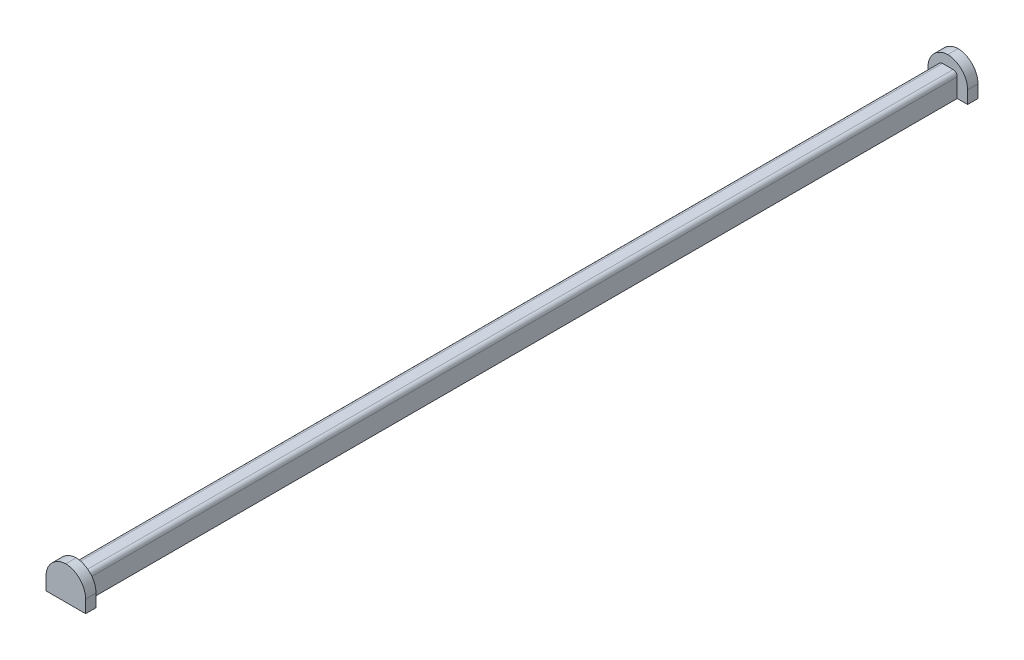
ISO-10303-21;
HEADER;
FILE_DESCRIPTION(('STEP AP214'),'2;1');
FILE_NAME('part.step','',(''),(''),'','','');
FILE_SCHEMA(('AUTOMOTIVE_DESIGN { 1 0 10303 214 1 1 1 1 }'));
ENDSEC;
DATA;
#1=APPLICATION_CONTEXT('core data for automotive mechanical design processes');
#2=APPLICATION_PROTOCOL_DEFINITION('international standard','automotive_design',2000,#1);
#3=PRODUCT_CONTEXT('',#1,'mechanical');
#4=PRODUCT('Part','Part','',(#3));
#5=PRODUCT_RELATED_PRODUCT_CATEGORY('part','',(#4));
#6=PRODUCT_DEFINITION_FORMATION('','',#4);
#7=PRODUCT_DEFINITION_CONTEXT('part definition',#1,'design');
#8=PRODUCT_DEFINITION('design','',#6,#7);
#9=PRODUCT_DEFINITION_SHAPE('','',#8);
#10=(LENGTH_UNIT() NAMED_UNIT(*) SI_UNIT(.MILLI.,.METRE.));
#11=(NAMED_UNIT(*) PLANE_ANGLE_UNIT() SI_UNIT($,.RADIAN.));
#12=(NAMED_UNIT(*) SI_UNIT($,.STERADIAN.) SOLID_ANGLE_UNIT());
#13=UNCERTAINTY_MEASURE_WITH_UNIT(LENGTH_MEASURE(1.E-05),#10,'distance_accuracy_value','');
#14=(GEOMETRIC_REPRESENTATION_CONTEXT(3) GLOBAL_UNCERTAINTY_ASSIGNED_CONTEXT((#13)) GLOBAL_UNIT_ASSIGNED_CONTEXT((#10,
#11,#12)) REPRESENTATION_CONTEXT('',''));
#15=CARTESIAN_POINT('',(0.,0.,0.));
#16=DIRECTION('',(0.,0.,1.));
#17=DIRECTION('',(1.,0.,0.));
#18=AXIS2_PLACEMENT_3D('',#15,#16,#17);
#19=CARTESIAN_POINT('',(3.032125,0.142875,133.35));
#20=DIRECTION('',(0.,-1.,0.));
#21=DIRECTION('',(1.,0.,0.));
#22=AXIS2_PLACEMENT_3D('',#19,#20,#21);
#23=PLANE('',#22);
#24=DIRECTION('',(0.,0.,-1.));
#25=VECTOR('',#24,1.);
#26=CARTESIAN_POINT('',(0.142875,0.142875,133.35));
#27=LINE('',#26,#25);
#28=CARTESIAN_POINT('',(0.142875,0.142875,133.35));
#29=VERTEX_POINT('',#28);
#30=CARTESIAN_POINT('',(0.142875,0.142875,0.));
#31=VERTEX_POINT('',#30);
#32=EDGE_CURVE('E219',#29,#31,#27,.T.);
#33=ORIENTED_EDGE('',*,*,#32,.T.);
#34=DIRECTION('',(1.,0.,0.));
#35=VECTOR('',#34,1.);
#36=CARTESIAN_POINT('',(-1.444625,0.142875,0.));
#37=LINE('',#36,#35);
#38=CARTESIAN_POINT('',(-1.444625,0.142875,0.));
#39=VERTEX_POINT('',#38);
#40=EDGE_CURVE('E156',#39,#31,#37,.T.);
#41=ORIENTED_EDGE('',*,*,#40,.F.);
#42=DIRECTION('',(0.,0.,1.));
#43=VECTOR('',#42,1.);
#44=CARTESIAN_POINT('',(-1.444625,0.142875,-1.5875));
#45=LINE('',#44,#43);
#46=CARTESIAN_POINT('',(-1.444625,0.142875,-1.5875));
#47=VERTEX_POINT('',#46);
#48=EDGE_CURVE('E148',#47,#39,#45,.T.);
#49=ORIENTED_EDGE('',*,*,#48,.F.);
#50=DIRECTION('',(1.,0.,0.));
#51=VECTOR('',#50,1.);
#52=CARTESIAN_POINT('',(-1.444625,0.142875,-1.5875));
#53=LINE('',#52,#51);
#54=CARTESIAN_POINT('',(4.619625,0.142875,-1.5875));
#55=VERTEX_POINT('',#54);
#56=EDGE_CURVE('E153',#47,#55,#53,.T.);
#57=ORIENTED_EDGE('',*,*,#56,.T.);
#58=DIRECTION('',(0.,0.,1.));
#59=VECTOR('',#58,1.);
#60=CARTESIAN_POINT('',(4.619625,0.142875,-1.5875));
#61=LINE('',#60,#59);
#62=CARTESIAN_POINT('',(4.619625,0.142875,0.));
#63=VERTEX_POINT('',#62);
#64=EDGE_CURVE('E160',#55,#63,#61,.T.);
#65=ORIENTED_EDGE('',*,*,#64,.T.);
#66=CARTESIAN_POINT('',(3.032125,0.142875,0.));
#67=VERTEX_POINT('',#66);
#68=EDGE_CURVE('E179',#67,#63,#37,.T.);
#69=ORIENTED_EDGE('',*,*,#68,.F.);
#70=DIRECTION('',(0.,0.,-1.));
#71=VECTOR('',#70,1.);
#72=CARTESIAN_POINT('',(3.032125,0.142875,133.35));
#73=LINE('',#72,#71);
#74=CARTESIAN_POINT('',(3.032125,0.142875,133.35));
#75=VERTEX_POINT('',#74);
#76=EDGE_CURVE('E224',#75,#67,#73,.T.);
#77=ORIENTED_EDGE('',*,*,#76,.F.);
#78=DIRECTION('',(1.,0.,0.));
#79=VECTOR('',#78,1.);
#80=CARTESIAN_POINT('',(-1.444625,0.142875,133.35));
#81=LINE('',#80,#79);
#82=CARTESIAN_POINT('',(4.619625,0.142875,133.35));
#83=VERTEX_POINT('',#82);
#84=EDGE_CURVE('E199',#75,#83,#81,.T.);
#85=ORIENTED_EDGE('',*,*,#84,.T.);
#86=DIRECTION('',(0.,0.,-1.));
#87=VECTOR('',#86,1.);
#88=CARTESIAN_POINT('',(4.619625,0.142875,134.9375));
#89=LINE('',#88,#87);
#90=CARTESIAN_POINT('',(4.619625,0.142875,134.9375));
#91=VERTEX_POINT('',#90);
#92=EDGE_CURVE('E195',#91,#83,#89,.T.);
#93=ORIENTED_EDGE('',*,*,#92,.F.);
#94=DIRECTION('',(1.,0.,0.));
#95=VECTOR('',#94,1.);
#96=CARTESIAN_POINT('',(-1.444625,0.142875,134.9375));
#97=LINE('',#96,#95);
#98=CARTESIAN_POINT('',(-1.444625,0.142875,134.9375));
#99=VERTEX_POINT('',#98);
#100=EDGE_CURVE('E189',#99,#91,#97,.T.);
#101=ORIENTED_EDGE('',*,*,#100,.F.);
#102=DIRECTION('',(0.,0.,-1.));
#103=VECTOR('',#102,1.);
#104=CARTESIAN_POINT('',(-1.444625,0.142875,134.9375));
#105=LINE('',#104,#103);
#106=CARTESIAN_POINT('',(-1.444625,0.142875,133.35));
#107=VERTEX_POINT('',#106);
#108=EDGE_CURVE('E205',#99,#107,#105,.T.);
#109=ORIENTED_EDGE('',*,*,#108,.T.);
#110=EDGE_CURVE('E200',#107,#29,#81,.T.);
#111=ORIENTED_EDGE('',*,*,#110,.T.);
#112=EDGE_LOOP('',(#33,#41,#49,#57,#65,#69,#77,#85,#93,#101,#109,#111));
#113=FACE_BOUND('',#112,.T.);
#114=ADVANCED_FACE('F37',(#113),#23,.T.);
#115=CARTESIAN_POINT('',(3.032125,1.905,133.35));
#116=DIRECTION('',(1.,0.,0.));
#117=DIRECTION('',(0.,0.,-1.));
#118=AXIS2_PLACEMENT_3D('',#115,#116,#117);
#119=PLANE('',#118);
#120=DIRECTION('',(0.,-1.,0.));
#121=VECTOR('',#120,1.);
#122=CARTESIAN_POINT('',(3.032125,1.905,0.));
#123=LINE('',#122,#121);
#124=CARTESIAN_POINT('',(3.032125,3.032125,0.));
#125=VERTEX_POINT('',#124);
#126=EDGE_CURVE('E214',#125,#67,#123,.T.);
#127=ORIENTED_EDGE('',*,*,#126,.F.);
#128=DIRECTION('',(0.,0.,-1.));
#129=VECTOR('',#128,1.);
#130=CARTESIAN_POINT('',(3.032125,3.032125,133.35));
#131=LINE('',#130,#129);
#132=CARTESIAN_POINT('',(3.032125,3.032125,133.35));
#133=VERTEX_POINT('',#132);
#134=EDGE_CURVE('E52',#125,#133,#131,.F.);
#135=ORIENTED_EDGE('',*,*,#134,.T.);
#136=DIRECTION('',(0.,-1.,0.));
#137=VECTOR('',#136,1.);
#138=CARTESIAN_POINT('',(3.032125,3.667125,133.35));
#139=LINE('',#138,#137);
#140=EDGE_CURVE('E217',#133,#75,#139,.T.);
#141=ORIENTED_EDGE('',*,*,#140,.T.);
#142=ORIENTED_EDGE('',*,*,#76,.T.);
#143=EDGE_LOOP('',(#127,#135,#141,#142));
#144=FACE_BOUND('',#143,.T.);
#145=ADVANCED_FACE('F291',(#144),#119,.T.);
#146=CARTESIAN_POINT('',(0.142874999999999,3.667125,133.35));
#147=DIRECTION('',(0.,1.,0.));
#148=DIRECTION('',(0.,0.,1.));
#149=AXIS2_PLACEMENT_3D('',#146,#147,#148);
#150=PLANE('',#149);
#151=DIRECTION('',(1.,0.,0.));
#152=VECTOR('',#151,1.);
#153=CARTESIAN_POINT('',(0.142874999999999,3.667125,0.));
#154=LINE('',#153,#152);
#155=CARTESIAN_POINT('',(0.777874999999999,3.667125,0.));
#156=VERTEX_POINT('',#155);
#157=CARTESIAN_POINT('',(2.397125,3.667125,0.));
#158=VERTEX_POINT('',#157);
#159=EDGE_CURVE('E221',#156,#158,#154,.T.);
#160=ORIENTED_EDGE('',*,*,#159,.F.);
#161=DIRECTION('',(0.,0.,-1.));
#162=VECTOR('',#161,1.);
#163=CARTESIAN_POINT('',(0.777874999999999,3.667125,133.35));
#164=LINE('',#163,#162);
#165=CARTESIAN_POINT('',(0.777874999999999,3.667125,133.35));
#166=VERTEX_POINT('',#165);
#167=EDGE_CURVE('E262',#156,#166,#164,.F.);
#168=ORIENTED_EDGE('',*,*,#167,.T.);
#169=DIRECTION('',(1.,0.,0.));
#170=VECTOR('',#169,1.);
#171=CARTESIAN_POINT('',(0.142874999999999,3.667125,133.35));
#172=LINE('',#171,#170);
#173=CARTESIAN_POINT('',(2.397125,3.667125,133.35));
#174=VERTEX_POINT('',#173);
#175=EDGE_CURVE('E213',#166,#174,#172,.T.);
#176=ORIENTED_EDGE('',*,*,#175,.T.);
#177=DIRECTION('',(0.,0.,-1.));
#178=VECTOR('',#177,1.);
#179=CARTESIAN_POINT('',(2.397125,3.667125,133.35));
#180=LINE('',#179,#178);
#181=EDGE_CURVE('E259',#174,#158,#180,.T.);
#182=ORIENTED_EDGE('',*,*,#181,.T.);
#183=EDGE_LOOP('',(#160,#168,#176,#182));
#184=FACE_BOUND('',#183,.T.);
#185=ADVANCED_FACE('F284',(#184),#150,.T.);
#186=CARTESIAN_POINT('',(0.142874999999999,3.667125,133.35));
#187=DIRECTION('',(1.,0.,0.));
#188=DIRECTION('',(0.,1.,0.));
#189=AXIS2_PLACEMENT_3D('',#186,#187,#188);
#190=PLANE('',#189);
#191=DIRECTION('',(0.,1.,0.));
#192=VECTOR('',#191,1.);
#193=CARTESIAN_POINT('',(0.142875,0.142875,133.35));
#194=LINE('',#193,#192);
#195=CARTESIAN_POINT('',(0.142874999999999,3.032125,133.35));
#196=VERTEX_POINT('',#195);
#197=EDGE_CURVE('E210',#29,#196,#194,.T.);
#198=ORIENTED_EDGE('',*,*,#197,.T.);
#199=DIRECTION('',(0.,0.,-1.));
#200=VECTOR('',#199,1.);
#201=CARTESIAN_POINT('',(0.142874999999999,3.032125,0.));
#202=LINE('',#201,#200);
#203=CARTESIAN_POINT('',(0.142874999999999,3.032125,0.));
#204=VERTEX_POINT('',#203);
#205=EDGE_CURVE('E254',#196,#204,#202,.T.);
#206=ORIENTED_EDGE('',*,*,#205,.T.);
#207=DIRECTION('',(0.,-1.,0.));
#208=VECTOR('',#207,1.);
#209=CARTESIAN_POINT('',(0.142874999999999,3.667125,0.));
#210=LINE('',#209,#208);
#211=EDGE_CURVE('E207',#204,#31,#210,.T.);
#212=ORIENTED_EDGE('',*,*,#211,.T.);
#213=ORIENTED_EDGE('',*,*,#32,.F.);
#214=EDGE_LOOP('',(#198,#206,#212,#213));
#215=FACE_BOUND('',#214,.T.);
#216=ADVANCED_FACE('F278',(#215),#190,.F.);
#217=CARTESIAN_POINT('',(-1.444625,0.142875,134.9375));
#218=DIRECTION('',(-1.,0.,0.));
#219=DIRECTION('',(0.,0.,1.));
#220=AXIS2_PLACEMENT_3D('',#217,#218,#219);
#221=PLANE('',#220);
#222=DIRECTION('',(0.,1.,0.));
#223=VECTOR('',#222,1.);
#224=CARTESIAN_POINT('',(-1.444625,0.142875,134.9375));
#225=LINE('',#224,#223);
#226=CARTESIAN_POINT('',(-1.444625,2.079625,134.9375));
#227=VERTEX_POINT('',#226);
#228=EDGE_CURVE('E192',#99,#227,#225,.T.);
#229=ORIENTED_EDGE('',*,*,#228,.T.);
#230=DIRECTION('',(0.,0.,-1.));
#231=VECTOR('',#230,1.);
#232=CARTESIAN_POINT('',(-1.444625,2.079625,134.9375));
#233=LINE('',#232,#231);
#234=CARTESIAN_POINT('',(-1.444625,2.079625,133.35));
#235=VERTEX_POINT('',#234);
#236=EDGE_CURVE('E227',#227,#235,#233,.T.);
#237=ORIENTED_EDGE('',*,*,#236,.T.);
#238=DIRECTION('',(0.,1.,0.));
#239=VECTOR('',#238,1.);
#240=CARTESIAN_POINT('',(-1.444625,0.142875,133.35));
#241=LINE('',#240,#239);
#242=EDGE_CURVE('E190',#107,#235,#241,.T.);
#243=ORIENTED_EDGE('',*,*,#242,.F.);
#244=ORIENTED_EDGE('',*,*,#108,.F.);
#245=EDGE_LOOP('',(#229,#237,#243,#244));
#246=FACE_BOUND('',#245,.T.);
#247=ADVANCED_FACE('F378',(#246),#221,.T.);
#248=CARTESIAN_POINT('',(4.619625,0.142875,134.9375));
#249=DIRECTION('',(-1.,0.,0.));
#250=DIRECTION('',(0.,0.,1.));
#251=AXIS2_PLACEMENT_3D('',#248,#249,#250);
#252=PLANE('',#251);
#253=DIRECTION('',(0.,1.,0.));
#254=VECTOR('',#253,1.);
#255=CARTESIAN_POINT('',(4.619625,0.142875,133.35));
#256=LINE('',#255,#254);
#257=CARTESIAN_POINT('',(4.619625,2.079625,133.35));
#258=VERTEX_POINT('',#257);
#259=EDGE_CURVE('E196',#83,#258,#256,.T.);
#260=ORIENTED_EDGE('',*,*,#259,.T.);
#261=DIRECTION('',(0.,0.,-1.));
#262=VECTOR('',#261,1.);
#263=CARTESIAN_POINT('',(4.619625,2.079625,134.9375));
#264=LINE('',#263,#262);
#265=CARTESIAN_POINT('',(4.619625,2.079625,134.9375));
#266=VERTEX_POINT('',#265);
#267=EDGE_CURVE('E239',#258,#266,#264,.F.);
#268=ORIENTED_EDGE('',*,*,#267,.T.);
#269=DIRECTION('',(0.,1.,0.));
#270=VECTOR('',#269,1.);
#271=CARTESIAN_POINT('',(4.619625,0.142875,134.9375));
#272=LINE('',#271,#270);
#273=EDGE_CURVE('E186',#91,#266,#272,.T.);
#274=ORIENTED_EDGE('',*,*,#273,.F.);
#275=ORIENTED_EDGE('',*,*,#92,.T.);
#276=EDGE_LOOP('',(#260,#268,#274,#275));
#277=FACE_BOUND('',#276,.T.);
#278=ADVANCED_FACE('F450',(#277),#252,.F.);
#279=CARTESIAN_POINT('',(0.,0.,134.9375));
#280=DIRECTION('',(0.,0.,1.));
#281=DIRECTION('',(1.,0.,0.));
#282=AXIS2_PLACEMENT_3D('',#279,#280,#281);
#283=PLANE('',#282);
#284=CARTESIAN_POINT('',(1.444625,2.079625,134.9375));
#285=DIRECTION('',(0.,0.,1.));
#286=DIRECTION('',(1.,0.,0.));
#287=AXIS2_PLACEMENT_3D('',#284,#285,#286);
#288=CIRCLE('',#287,3.175);
#289=CARTESIAN_POINT('',(1.5875,5.25140868341458,134.9375));
#290=VERTEX_POINT('',#289);
#291=EDGE_CURVE('E235',#266,#290,#288,.T.);
#292=ORIENTED_EDGE('',*,*,#291,.T.);
#293=CARTESIAN_POINT('',(1.730375,2.079625,134.9375));
#294=DIRECTION('',(0.,0.,1.));
#295=DIRECTION('',(1.,0.,0.));
#296=AXIS2_PLACEMENT_3D('',#293,#294,#295);
#297=CIRCLE('',#296,3.175);
#298=EDGE_CURVE('E237',#290,#227,#297,.T.);
#299=ORIENTED_EDGE('',*,*,#298,.T.);
#300=ORIENTED_EDGE('',*,*,#228,.F.);
#301=ORIENTED_EDGE('',*,*,#100,.T.);
#302=ORIENTED_EDGE('',*,*,#273,.T.);
#303=EDGE_LOOP('',(#292,#299,#300,#301,#302));
#304=FACE_BOUND('',#303,.T.);
#305=ADVANCED_FACE('F365',(#304),#283,.T.);
#306=CARTESIAN_POINT('',(0.,0.,133.35));
#307=DIRECTION('',(0.,0.,1.));
#308=DIRECTION('',(1.,0.,0.));
#309=AXIS2_PLACEMENT_3D('',#306,#307,#308);
#310=PLANE('',#309);
#311=ORIENTED_EDGE('',*,*,#242,.T.);
#312=CARTESIAN_POINT('',(1.730375,2.079625,133.35));
#313=DIRECTION('',(0.,0.,1.));
#314=DIRECTION('',(1.,0.,0.));
#315=AXIS2_PLACEMENT_3D('',#312,#313,#314);
#316=CIRCLE('',#315,3.175);
#317=CARTESIAN_POINT('',(1.5875,5.25140868341458,133.35));
#318=VERTEX_POINT('',#317);
#319=EDGE_CURVE('E233',#235,#318,#316,.F.);
#320=ORIENTED_EDGE('',*,*,#319,.T.);
#321=CARTESIAN_POINT('',(1.444625,2.079625,133.35));
#322=DIRECTION('',(0.,0.,1.));
#323=DIRECTION('',(1.,0.,0.));
#324=AXIS2_PLACEMENT_3D('',#321,#322,#323);
#325=CIRCLE('',#324,3.175);
#326=EDGE_CURVE('E231',#318,#258,#325,.F.);
#327=ORIENTED_EDGE('',*,*,#326,.T.);
#328=ORIENTED_EDGE('',*,*,#259,.F.);
#329=ORIENTED_EDGE('',*,*,#84,.F.);
#330=ORIENTED_EDGE('',*,*,#140,.F.);
#331=CARTESIAN_POINT('',(2.397125,3.032125,133.35));
#332=DIRECTION('',(0.,0.,1.));
#333=DIRECTION('',(1.,0.,0.));
#334=AXIS2_PLACEMENT_3D('',#331,#332,#333);
#335=CIRCLE('',#334,0.635);
#336=EDGE_CURVE('E11',#133,#174,#335,.T.);
#337=ORIENTED_EDGE('',*,*,#336,.T.);
#338=ORIENTED_EDGE('',*,*,#175,.F.);
#339=CARTESIAN_POINT('',(0.777874999999999,3.032125,133.35));
#340=DIRECTION('',(0.,0.,1.));
#341=DIRECTION('',(1.,0.,0.));
#342=AXIS2_PLACEMENT_3D('',#339,#340,#341);
#343=CIRCLE('',#342,0.635);
#344=EDGE_CURVE('E267',#166,#196,#343,.T.);
#345=ORIENTED_EDGE('',*,*,#344,.T.);
#346=ORIENTED_EDGE('',*,*,#197,.F.);
#347=ORIENTED_EDGE('',*,*,#110,.F.);
#348=EDGE_LOOP('',(#311,#320,#327,#328,#329,#330,#337,#338,#345,#346,#347));
#349=FACE_BOUND('',#348,.T.);
#350=ADVANCED_FACE('F271',(#349),#310,.F.);
#351=CARTESIAN_POINT('',(1.444625,2.079625,134.9375));
#352=DIRECTION('',(0.,0.,1.));
#353=DIRECTION('',(1.,0.,0.));
#354=AXIS2_PLACEMENT_3D('',#351,#352,#353);
#355=CYLINDRICAL_SURFACE('',#354,3.175);
#356=DIRECTION('',(0.,0.,1.));
#357=VECTOR('',#356,1.);
#358=CARTESIAN_POINT('',(1.5875,5.25140868341458,134.14375));
#359=LINE('',#358,#357);
#360=EDGE_CURVE('E184',#290,#318,#359,.F.);
#361=ORIENTED_EDGE('',*,*,#360,.F.);
#362=ORIENTED_EDGE('',*,*,#291,.F.);
#363=ORIENTED_EDGE('',*,*,#267,.F.);
#364=ORIENTED_EDGE('',*,*,#326,.F.);
#365=EDGE_LOOP('',(#361,#362,#363,#364));
#366=FACE_BOUND('',#365,.T.);
#367=ADVANCED_FACE('F313',(#366),#355,.T.);
#368=CARTESIAN_POINT('',(1.730375,2.079625,134.9375));
#369=DIRECTION('',(0.,0.,-1.));
#370=DIRECTION('',(-1.,0.,0.));
#371=AXIS2_PLACEMENT_3D('',#368,#369,#370);
#372=CYLINDRICAL_SURFACE('',#371,3.175);
#373=ORIENTED_EDGE('',*,*,#298,.F.);
#374=ORIENTED_EDGE('',*,*,#360,.T.);
#375=ORIENTED_EDGE('',*,*,#319,.F.);
#376=ORIENTED_EDGE('',*,*,#236,.F.);
#377=EDGE_LOOP('',(#373,#374,#375,#376));
#378=FACE_BOUND('',#377,.T.);
#379=ADVANCED_FACE('F306',(#378),#372,.T.);
#380=CARTESIAN_POINT('',(4.619625,0.142875,-1.5875));
#381=DIRECTION('',(1.,0.,0.));
#382=DIRECTION('',(0.,0.,-1.));
#383=AXIS2_PLACEMENT_3D('',#380,#381,#382);
#384=PLANE('',#383);
#385=DIRECTION('',(0.,1.,0.));
#386=VECTOR('',#385,1.);
#387=CARTESIAN_POINT('',(4.619625,0.142875,-1.5875));
#388=LINE('',#387,#386);
#389=CARTESIAN_POINT('',(4.619625,2.079625,-1.5875));
#390=VERTEX_POINT('',#389);
#391=EDGE_CURVE('E161',#55,#390,#388,.T.);
#392=ORIENTED_EDGE('',*,*,#391,.T.);
#393=DIRECTION('',(0.,0.,1.));
#394=VECTOR('',#393,1.);
#395=CARTESIAN_POINT('',(4.619625,2.079625,0.));
#396=LINE('',#395,#394);
#397=CARTESIAN_POINT('',(4.619625,2.079625,0.));
#398=VERTEX_POINT('',#397);
#399=EDGE_CURVE('E252',#390,#398,#396,.T.);
#400=ORIENTED_EDGE('',*,*,#399,.T.);
#401=DIRECTION('',(0.,1.,0.));
#402=VECTOR('',#401,1.);
#403=CARTESIAN_POINT('',(4.619625,0.142875,0.));
#404=LINE('',#403,#402);
#405=EDGE_CURVE('E170',#63,#398,#404,.T.);
#406=ORIENTED_EDGE('',*,*,#405,.F.);
#407=ORIENTED_EDGE('',*,*,#64,.F.);
#408=EDGE_LOOP('',(#392,#400,#406,#407));
#409=FACE_BOUND('',#408,.T.);
#410=ADVANCED_FACE('F304',(#409),#384,.T.);
#411=CARTESIAN_POINT('',(-1.444625,0.142875,-1.5875));
#412=DIRECTION('',(1.,0.,0.));
#413=DIRECTION('',(0.,0.,-1.));
#414=AXIS2_PLACEMENT_3D('',#411,#412,#413);
#415=PLANE('',#414);
#416=DIRECTION('',(0.,1.,0.));
#417=VECTOR('',#416,1.);
#418=CARTESIAN_POINT('',(-1.444625,0.142875,0.));
#419=LINE('',#418,#417);
#420=CARTESIAN_POINT('',(-1.444625,2.079625,0.));
#421=VERTEX_POINT('',#420);
#422=EDGE_CURVE('E177',#39,#421,#419,.T.);
#423=ORIENTED_EDGE('',*,*,#422,.T.);
#424=DIRECTION('',(0.,0.,1.));
#425=VECTOR('',#424,1.);
#426=CARTESIAN_POINT('',(-1.444625,2.079625,-1.5875));
#427=LINE('',#426,#425);
#428=CARTESIAN_POINT('',(-1.444625,2.079625,-1.5875));
#429=VERTEX_POINT('',#428);
#430=EDGE_CURVE('E168',#421,#429,#427,.F.);
#431=ORIENTED_EDGE('',*,*,#430,.T.);
#432=DIRECTION('',(0.,1.,0.));
#433=VECTOR('',#432,1.);
#434=CARTESIAN_POINT('',(-1.444625,0.142875,-1.5875));
#435=LINE('',#434,#433);
#436=EDGE_CURVE('E165',#47,#429,#435,.T.);
#437=ORIENTED_EDGE('',*,*,#436,.F.);
#438=ORIENTED_EDGE('',*,*,#48,.T.);
#439=EDGE_LOOP('',(#423,#431,#437,#438));
#440=FACE_BOUND('',#439,.T.);
#441=ADVANCED_FACE('F166',(#440),#415,.F.);
#442=CARTESIAN_POINT('',(0.,0.,-1.5875));
#443=DIRECTION('',(0.,0.,-1.));
#444=DIRECTION('',(1.,0.,0.));
#445=AXIS2_PLACEMENT_3D('',#442,#443,#444);
#446=PLANE('',#445);
#447=ORIENTED_EDGE('',*,*,#436,.T.);
#448=CARTESIAN_POINT('',(1.730375,2.079625,-1.5875));
#449=DIRECTION('',(0.,0.,-1.));
#450=DIRECTION('',(-1.,0.,0.));
#451=AXIS2_PLACEMENT_3D('',#448,#449,#450);
#452=CIRCLE('',#451,3.175);
#453=CARTESIAN_POINT('',(1.5875,5.25140868341458,-1.5875));
#454=VERTEX_POINT('',#453);
#455=EDGE_CURVE('E250',#429,#454,#452,.T.);
#456=ORIENTED_EDGE('',*,*,#455,.T.);
#457=CARTESIAN_POINT('',(1.444625,2.079625,-1.5875));
#458=DIRECTION('',(0.,0.,-1.));
#459=DIRECTION('',(-1.,0.,0.));
#460=AXIS2_PLACEMENT_3D('',#457,#458,#459);
#461=CIRCLE('',#460,3.175);
#462=EDGE_CURVE('E248',#454,#390,#461,.T.);
#463=ORIENTED_EDGE('',*,*,#462,.T.);
#464=ORIENTED_EDGE('',*,*,#391,.F.);
#465=ORIENTED_EDGE('',*,*,#56,.F.);
#466=EDGE_LOOP('',(#447,#456,#463,#464,#465));
#467=FACE_BOUND('',#466,.T.);
#468=ADVANCED_FACE('F172',(#467),#446,.T.);
#469=CARTESIAN_POINT('',(0.,0.,0.));
#470=DIRECTION('',(0.,0.,-1.));
#471=DIRECTION('',(1.,0.,0.));
#472=AXIS2_PLACEMENT_3D('',#469,#470,#471);
#473=PLANE('',#472);
#474=CARTESIAN_POINT('',(1.444625,2.079625,0.));
#475=DIRECTION('',(0.,0.,-1.));
#476=DIRECTION('',(-1.,0.,0.));
#477=AXIS2_PLACEMENT_3D('',#474,#475,#476);
#478=CIRCLE('',#477,3.175);
#479=CARTESIAN_POINT('',(1.5875,5.25140868341458,0.));
#480=VERTEX_POINT('',#479);
#481=EDGE_CURVE('E241',#398,#480,#478,.F.);
#482=ORIENTED_EDGE('',*,*,#481,.T.);
#483=CARTESIAN_POINT('',(1.730375,2.079625,0.));
#484=DIRECTION('',(0.,0.,-1.));
#485=DIRECTION('',(-1.,0.,0.));
#486=AXIS2_PLACEMENT_3D('',#483,#484,#485);
#487=CIRCLE('',#486,3.175);
#488=EDGE_CURVE('E245',#480,#421,#487,.F.);
#489=ORIENTED_EDGE('',*,*,#488,.T.);
#490=ORIENTED_EDGE('',*,*,#422,.F.);
#491=ORIENTED_EDGE('',*,*,#40,.T.);
#492=ORIENTED_EDGE('',*,*,#211,.F.);
#493=CARTESIAN_POINT('',(0.777874999999999,3.032125,0.));
#494=DIRECTION('',(0.,0.,-1.));
#495=DIRECTION('',(-1.,0.,0.));
#496=AXIS2_PLACEMENT_3D('',#493,#494,#495);
#497=CIRCLE('',#496,0.635);
#498=EDGE_CURVE('E265',#204,#156,#497,.T.);
#499=ORIENTED_EDGE('',*,*,#498,.T.);
#500=ORIENTED_EDGE('',*,*,#159,.T.);
#501=CARTESIAN_POINT('',(2.397125,3.032125,0.));
#502=DIRECTION('',(0.,0.,-1.));
#503=DIRECTION('',(-1.,0.,0.));
#504=AXIS2_PLACEMENT_3D('',#501,#502,#503);
#505=CIRCLE('',#504,0.635);
#506=EDGE_CURVE('E45',#158,#125,#505,.T.);
#507=ORIENTED_EDGE('',*,*,#506,.T.);
#508=ORIENTED_EDGE('',*,*,#126,.T.);
#509=ORIENTED_EDGE('',*,*,#68,.T.);
#510=ORIENTED_EDGE('',*,*,#405,.T.);
#511=EDGE_LOOP('',(#482,#489,#490,#491,#492,#499,#500,#507,#508,#509,#510));
#512=FACE_BOUND('',#511,.T.);
#513=ADVANCED_FACE('F282',(#512),#473,.F.);
#514=CARTESIAN_POINT('',(1.444625,2.079625,-1.5875));
#515=DIRECTION('',(0.,0.,-1.));
#516=DIRECTION('',(-1.,0.,0.));
#517=AXIS2_PLACEMENT_3D('',#514,#515,#516);
#518=CYLINDRICAL_SURFACE('',#517,3.175);
#519=ORIENTED_EDGE('',*,*,#399,.F.);
#520=ORIENTED_EDGE('',*,*,#462,.F.);
#521=DIRECTION('',(0.,0.,-1.));
#522=VECTOR('',#521,1.);
#523=CARTESIAN_POINT('',(1.5875,5.25140868341458,-0.79375));
#524=LINE('',#523,#522);
#525=EDGE_CURVE('E180',#480,#454,#524,.T.);
#526=ORIENTED_EDGE('',*,*,#525,.F.);
#527=ORIENTED_EDGE('',*,*,#481,.F.);
#528=EDGE_LOOP('',(#519,#520,#526,#527));
#529=FACE_BOUND('',#528,.T.);
#530=ADVANCED_FACE('F299',(#529),#518,.T.);
#531=CARTESIAN_POINT('',(1.730375,2.079625,-1.5875));
#532=DIRECTION('',(0.,0.,1.));
#533=DIRECTION('',(1.,0.,0.));
#534=AXIS2_PLACEMENT_3D('',#531,#532,#533);
#535=CYLINDRICAL_SURFACE('',#534,3.175);
#536=ORIENTED_EDGE('',*,*,#455,.F.);
#537=ORIENTED_EDGE('',*,*,#430,.F.);
#538=ORIENTED_EDGE('',*,*,#488,.F.);
#539=ORIENTED_EDGE('',*,*,#525,.T.);
#540=EDGE_LOOP('',(#536,#537,#538,#539));
#541=FACE_BOUND('',#540,.T.);
#542=ADVANCED_FACE('F303',(#541),#535,.T.);
#543=CARTESIAN_POINT('',(0.777874999999999,3.032125,133.35));
#544=DIRECTION('',(0.,0.,1.));
#545=DIRECTION('',(1.,0.,0.));
#546=AXIS2_PLACEMENT_3D('',#543,#544,#545);
#547=CYLINDRICAL_SURFACE('',#546,0.635);
#548=ORIENTED_EDGE('',*,*,#344,.F.);
#549=ORIENTED_EDGE('',*,*,#167,.F.);
#550=ORIENTED_EDGE('',*,*,#498,.F.);
#551=ORIENTED_EDGE('',*,*,#205,.F.);
#552=EDGE_LOOP('',(#548,#549,#550,#551));
#553=FACE_BOUND('',#552,.T.);
#554=ADVANCED_FACE('F280',(#553),#547,.T.);
#555=CARTESIAN_POINT('',(2.397125,3.032125,133.35));
#556=DIRECTION('',(0.,0.,-1.));
#557=DIRECTION('',(-1.,0.,0.));
#558=AXIS2_PLACEMENT_3D('',#555,#556,#557);
#559=CYLINDRICAL_SURFACE('',#558,0.635);
#560=ORIENTED_EDGE('',*,*,#336,.F.);
#561=ORIENTED_EDGE('',*,*,#134,.F.);
#562=ORIENTED_EDGE('',*,*,#506,.F.);
#563=ORIENTED_EDGE('',*,*,#181,.F.);
#564=EDGE_LOOP('',(#560,#561,#562,#563));
#565=FACE_BOUND('',#564,.T.);
#566=ADVANCED_FACE('F39',(#565),#559,.T.);
#567=CLOSED_SHELL('',(#114,#145,#185,#216,#247,#278,#305,#350,#367,#379,#410,#441,#468,#513,
#530,#542,#554,#566));
#568=MANIFOLD_SOLID_BREP('B2',#567);
#569=ADVANCED_BREP_SHAPE_REPRESENTATION('',(#18,#568),#14);
#570=SHAPE_DEFINITION_REPRESENTATION(#9,#569);
ENDSEC;
END-ISO-10303-21;
